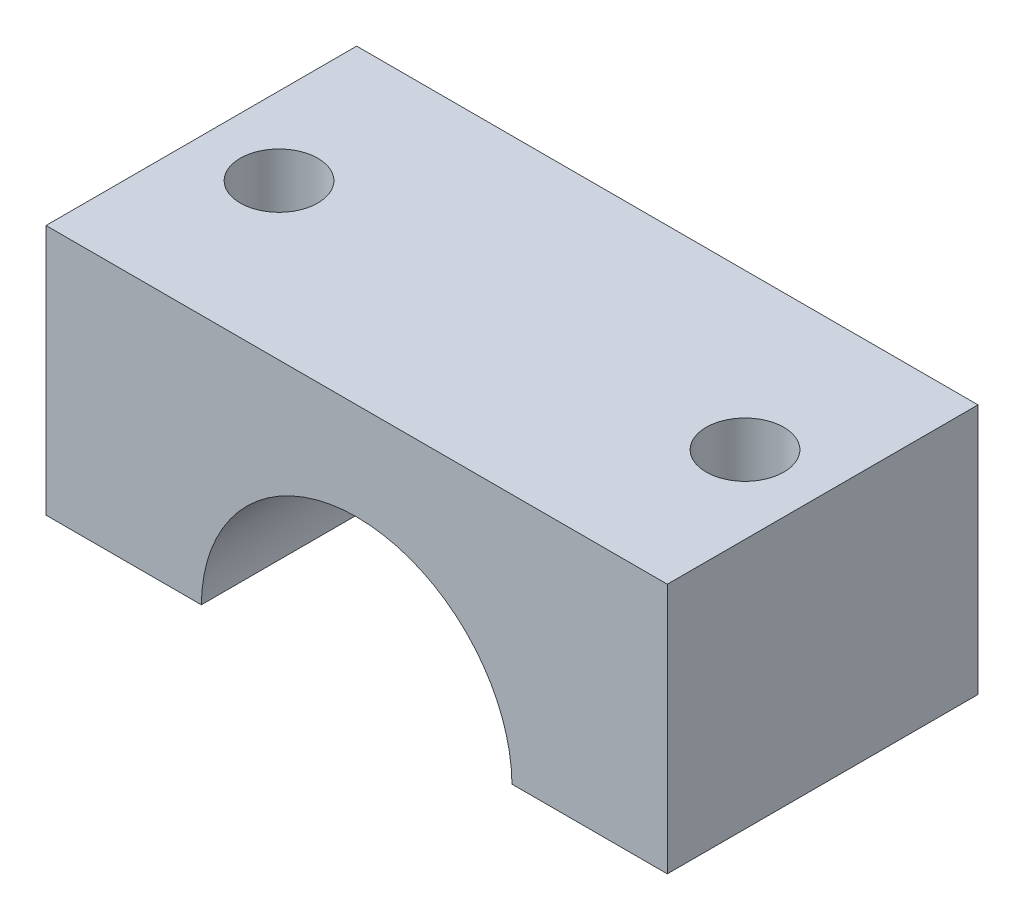
ISO-10303-21;
HEADER;
FILE_DESCRIPTION(('STEP AP214'),'2;1');
FILE_NAME('part.step','',(''),(''),'','','');
FILE_SCHEMA(('AUTOMOTIVE_DESIGN { 1 0 10303 214 1 1 1 1 }'));
ENDSEC;
DATA;
#1=APPLICATION_CONTEXT('core data for automotive mechanical design processes');
#2=APPLICATION_PROTOCOL_DEFINITION('international standard','automotive_design',2000,#1);
#3=PRODUCT_CONTEXT('',#1,'mechanical');
#4=PRODUCT('Part','Part','',(#3));
#5=PRODUCT_RELATED_PRODUCT_CATEGORY('part','',(#4));
#6=PRODUCT_DEFINITION_FORMATION('','',#4);
#7=PRODUCT_DEFINITION_CONTEXT('part definition',#1,'design');
#8=PRODUCT_DEFINITION('design','',#6,#7);
#9=PRODUCT_DEFINITION_SHAPE('','',#8);
#10=(LENGTH_UNIT() NAMED_UNIT(*) SI_UNIT(.MILLI.,.METRE.));
#11=(NAMED_UNIT(*) PLANE_ANGLE_UNIT() SI_UNIT($,.RADIAN.));
#12=(NAMED_UNIT(*) SI_UNIT($,.STERADIAN.) SOLID_ANGLE_UNIT());
#13=UNCERTAINTY_MEASURE_WITH_UNIT(LENGTH_MEASURE(1.E-05),#10,'distance_accuracy_value','');
#14=(GEOMETRIC_REPRESENTATION_CONTEXT(3) GLOBAL_UNCERTAINTY_ASSIGNED_CONTEXT((#13)) GLOBAL_UNIT_ASSIGNED_CONTEXT((#10,
#11,#12)) REPRESENTATION_CONTEXT('',''));
#15=CARTESIAN_POINT('',(0.,0.,0.));
#16=DIRECTION('',(0.,0.,1.));
#17=DIRECTION('',(1.,0.,0.));
#18=AXIS2_PLACEMENT_3D('',#15,#16,#17);
#19=CARTESIAN_POINT('',(0.,0.,0.));
#20=DIRECTION('',(0.,-1.,0.));
#21=DIRECTION('',(0.,0.,-1.));
#22=AXIS2_PLACEMENT_3D('',#19,#20,#21);
#23=PLANE('',#22);
#24=CARTESIAN_POINT('',(-19.05,0.,0.));
#25=DIRECTION('',(0.,-1.,0.));
#26=DIRECTION('',(0.,0.,-1.));
#27=AXIS2_PLACEMENT_3D('',#24,#25,#26);
#28=CIRCLE('',#27,3.175);
#29=CARTESIAN_POINT('',(-19.05,0.,-3.17499999999999));
#30=VERTEX_POINT('',#29);
#31=EDGE_CURVE('E146',#30,#30,#28,.T.);
#32=ORIENTED_EDGE('',*,*,#31,.F.);
#33=EDGE_LOOP('',(#32));
#34=FACE_BOUND('',#33,.T.);
#35=DIRECTION('',(0.,0.,-1.));
#36=VECTOR('',#35,1.);
#37=CARTESIAN_POINT('',(-12.6993649841242,0.,12.7));
#38=LINE('',#37,#36);
#39=CARTESIAN_POINT('',(-12.6993649841242,0.,12.7));
#40=VERTEX_POINT('',#39);
#41=CARTESIAN_POINT('',(-12.6993649841242,0.,-12.7));
#42=VERTEX_POINT('',#41);
#43=EDGE_CURVE('E11',#40,#42,#38,.T.);
#44=ORIENTED_EDGE('',*,*,#43,.F.);
#45=DIRECTION('',(1.,0.,0.));
#46=VECTOR('',#45,1.);
#47=CARTESIAN_POINT('',(-25.4,0.,12.7));
#48=LINE('',#47,#46);
#49=CARTESIAN_POINT('',(-25.4,0.,12.7));
#50=VERTEX_POINT('',#49);
#51=EDGE_CURVE('E119',#50,#40,#48,.T.);
#52=ORIENTED_EDGE('',*,*,#51,.F.);
#53=DIRECTION('',(0.,0.,1.));
#54=VECTOR('',#53,1.);
#55=CARTESIAN_POINT('',(-25.4,0.,12.7));
#56=LINE('',#55,#54);
#57=CARTESIAN_POINT('',(-25.4,0.,-12.7));
#58=VERTEX_POINT('',#57);
#59=EDGE_CURVE('E111',#58,#50,#56,.T.);
#60=ORIENTED_EDGE('',*,*,#59,.F.);
#61=DIRECTION('',(-1.,0.,0.));
#62=VECTOR('',#61,1.);
#63=CARTESIAN_POINT('',(-25.4,0.,-12.7));
#64=LINE('',#63,#62);
#65=EDGE_CURVE('E105',#42,#58,#64,.T.);
#66=ORIENTED_EDGE('',*,*,#65,.F.);
#67=EDGE_LOOP('',(#44,#52,#60,#66));
#68=FACE_BOUND('',#67,.T.);
#69=ADVANCED_FACE('F37',(#34,#68),#23,.T.);
#70=CARTESIAN_POINT('',(25.4,20.5105,12.7));
#71=DIRECTION('',(-1.,0.,0.));
#72=DIRECTION('',(0.,0.,1.));
#73=AXIS2_PLACEMENT_3D('',#70,#71,#72);
#74=PLANE('',#73);
#75=DIRECTION('',(0.,0.,-1.));
#76=VECTOR('',#75,1.);
#77=CARTESIAN_POINT('',(25.4,0.,12.7));
#78=LINE('',#77,#76);
#79=CARTESIAN_POINT('',(25.4,0.,12.7));
#80=VERTEX_POINT('',#79);
#81=CARTESIAN_POINT('',(25.4,0.,-12.7));
#82=VERTEX_POINT('',#81);
#83=EDGE_CURVE('E112',#80,#82,#78,.T.);
#84=ORIENTED_EDGE('',*,*,#83,.T.);
#85=DIRECTION('',(0.,-1.,0.));
#86=VECTOR('',#85,1.);
#87=CARTESIAN_POINT('',(25.4,20.5105,-12.7));
#88=LINE('',#87,#86);
#89=CARTESIAN_POINT('',(25.4,20.5105,-12.7));
#90=VERTEX_POINT('',#89);
#91=EDGE_CURVE('E129',#90,#82,#88,.T.);
#92=ORIENTED_EDGE('',*,*,#91,.F.);
#93=DIRECTION('',(0.,0.,-1.));
#94=VECTOR('',#93,1.);
#95=CARTESIAN_POINT('',(25.4,20.5105,12.7));
#96=LINE('',#95,#94);
#97=CARTESIAN_POINT('',(25.4,20.5105,12.7));
#98=VERTEX_POINT('',#97);
#99=EDGE_CURVE('E121',#98,#90,#96,.T.);
#100=ORIENTED_EDGE('',*,*,#99,.F.);
#101=DIRECTION('',(0.,-1.,0.));
#102=VECTOR('',#101,1.);
#103=CARTESIAN_POINT('',(25.4,20.5105,12.7));
#104=LINE('',#103,#102);
#105=EDGE_CURVE('E122',#98,#80,#104,.T.);
#106=ORIENTED_EDGE('',*,*,#105,.T.);
#107=EDGE_LOOP('',(#84,#92,#100,#106));
#108=FACE_BOUND('',#107,.T.);
#109=ADVANCED_FACE('F39',(#108),#74,.F.);
#110=CARTESIAN_POINT('',(-25.4,20.5105,-12.7));
#111=DIRECTION('',(0.,0.,1.));
#112=DIRECTION('',(1.,0.,0.));
#113=AXIS2_PLACEMENT_3D('',#110,#111,#112);
#114=PLANE('',#113);
#115=CARTESIAN_POINT('',(12.6993649841242,0.,-12.7));
#116=VERTEX_POINT('',#115);
#117=EDGE_CURVE('E107',#82,#116,#64,.T.);
#118=ORIENTED_EDGE('',*,*,#117,.T.);
#119=CARTESIAN_POINT('',(0.,-0.127,-12.7));
#120=DIRECTION('',(0.,0.,-1.));
#121=DIRECTION('',(-1.,0.,0.));
#122=AXIS2_PLACEMENT_3D('',#119,#120,#121);
#123=CIRCLE('',#122,12.7);
#124=EDGE_CURVE('E51',#42,#116,#123,.T.);
#125=ORIENTED_EDGE('',*,*,#124,.F.);
#126=ORIENTED_EDGE('',*,*,#65,.T.);
#127=DIRECTION('',(0.,-1.,0.));
#128=VECTOR('',#127,1.);
#129=CARTESIAN_POINT('',(-25.4,20.5105,-12.7));
#130=LINE('',#129,#128);
#131=CARTESIAN_POINT('',(-25.4,20.5105,-12.7));
#132=VERTEX_POINT('',#131);
#133=EDGE_CURVE('E127',#132,#58,#130,.T.);
#134=ORIENTED_EDGE('',*,*,#133,.F.);
#135=DIRECTION('',(-1.,0.,0.));
#136=VECTOR('',#135,1.);
#137=CARTESIAN_POINT('',(-25.4,20.5105,-12.7));
#138=LINE('',#137,#136);
#139=EDGE_CURVE('E89',#90,#132,#138,.T.);
#140=ORIENTED_EDGE('',*,*,#139,.F.);
#141=ORIENTED_EDGE('',*,*,#91,.T.);
#142=EDGE_LOOP('',(#118,#125,#126,#134,#140,#141));
#143=FACE_BOUND('',#142,.T.);
#144=ADVANCED_FACE('F104',(#143),#114,.F.);
#145=CARTESIAN_POINT('',(-25.4,20.5105,12.7));
#146=DIRECTION('',(1.,0.,0.));
#147=DIRECTION('',(0.,0.,-1.));
#148=AXIS2_PLACEMENT_3D('',#145,#146,#147);
#149=PLANE('',#148);
#150=ORIENTED_EDGE('',*,*,#59,.T.);
#151=DIRECTION('',(0.,-1.,0.));
#152=VECTOR('',#151,1.);
#153=CARTESIAN_POINT('',(-25.4,20.5105,12.7));
#154=LINE('',#153,#152);
#155=CARTESIAN_POINT('',(-25.4,20.5105,12.7));
#156=VERTEX_POINT('',#155);
#157=EDGE_CURVE('E124',#156,#50,#154,.T.);
#158=ORIENTED_EDGE('',*,*,#157,.F.);
#159=DIRECTION('',(0.,0.,1.));
#160=VECTOR('',#159,1.);
#161=CARTESIAN_POINT('',(-25.4,20.5105,12.7));
#162=LINE('',#161,#160);
#163=EDGE_CURVE('E139',#132,#156,#162,.T.);
#164=ORIENTED_EDGE('',*,*,#163,.F.);
#165=ORIENTED_EDGE('',*,*,#133,.T.);
#166=EDGE_LOOP('',(#150,#158,#164,#165));
#167=FACE_BOUND('',#166,.T.);
#168=ADVANCED_FACE('F189',(#167),#149,.F.);
#169=CARTESIAN_POINT('',(-25.4,20.5105,12.7));
#170=DIRECTION('',(0.,0.,-1.));
#171=DIRECTION('',(-1.,0.,0.));
#172=AXIS2_PLACEMENT_3D('',#169,#170,#171);
#173=PLANE('',#172);
#174=ORIENTED_EDGE('',*,*,#51,.T.);
#175=CARTESIAN_POINT('',(0.,-0.127,12.7));
#176=DIRECTION('',(0.,0.,-1.));
#177=DIRECTION('',(-1.,0.,0.));
#178=AXIS2_PLACEMENT_3D('',#175,#176,#177);
#179=CIRCLE('',#178,12.7);
#180=CARTESIAN_POINT('',(12.6993649841242,0.,12.7));
#181=VERTEX_POINT('',#180);
#182=EDGE_CURVE('E98',#40,#181,#179,.T.);
#183=ORIENTED_EDGE('',*,*,#182,.T.);
#184=EDGE_CURVE('E81',#181,#80,#48,.T.);
#185=ORIENTED_EDGE('',*,*,#184,.T.);
#186=ORIENTED_EDGE('',*,*,#105,.F.);
#187=DIRECTION('',(1.,0.,0.));
#188=VECTOR('',#187,1.);
#189=CARTESIAN_POINT('',(-25.4,20.5105,12.7));
#190=LINE('',#189,#188);
#191=EDGE_CURVE('E60',#156,#98,#190,.T.);
#192=ORIENTED_EDGE('',*,*,#191,.F.);
#193=ORIENTED_EDGE('',*,*,#157,.T.);
#194=EDGE_LOOP('',(#174,#183,#185,#186,#192,#193));
#195=FACE_BOUND('',#194,.T.);
#196=ADVANCED_FACE('F131',(#195),#173,.F.);
#197=CARTESIAN_POINT('',(0.,20.5105,0.));
#198=DIRECTION('',(0.,-1.,0.));
#199=DIRECTION('',(0.,0.,-1.));
#200=AXIS2_PLACEMENT_3D('',#197,#198,#199);
#201=PLANE('',#200);
#202=CARTESIAN_POINT('',(19.05,20.5105,0.));
#203=DIRECTION('',(0.,-1.,0.));
#204=DIRECTION('',(0.,0.,-1.));
#205=AXIS2_PLACEMENT_3D('',#202,#203,#204);
#206=CIRCLE('',#205,3.17499999999999);
#207=CARTESIAN_POINT('',(19.05,20.5105,-3.17499999999999));
#208=VERTEX_POINT('',#207);
#209=EDGE_CURVE('E149',#208,#208,#206,.T.);
#210=ORIENTED_EDGE('',*,*,#209,.T.);
#211=EDGE_LOOP('',(#210));
#212=FACE_BOUND('',#211,.T.);
#213=CARTESIAN_POINT('',(-19.05,20.5105,0.));
#214=DIRECTION('',(0.,-1.,0.));
#215=DIRECTION('',(0.,0.,-1.));
#216=AXIS2_PLACEMENT_3D('',#213,#214,#215);
#217=CIRCLE('',#216,3.17499999999999);
#218=CARTESIAN_POINT('',(-19.05,20.5105,-3.17499999999998));
#219=VERTEX_POINT('',#218);
#220=EDGE_CURVE('E108',#219,#219,#217,.T.);
#221=ORIENTED_EDGE('',*,*,#220,.T.);
#222=EDGE_LOOP('',(#221));
#223=FACE_BOUND('',#222,.T.);
#224=ORIENTED_EDGE('',*,*,#99,.T.);
#225=ORIENTED_EDGE('',*,*,#139,.T.);
#226=ORIENTED_EDGE('',*,*,#163,.T.);
#227=ORIENTED_EDGE('',*,*,#191,.T.);
#228=EDGE_LOOP('',(#224,#225,#226,#227));
#229=FACE_BOUND('',#228,.T.);
#230=ADVANCED_FACE('F159',(#212,#223,#229),#201,.F.);
#231=CARTESIAN_POINT('',(19.05,0.,0.));
#232=DIRECTION('',(0.,-1.,0.));
#233=DIRECTION('',(0.,0.,-1.));
#234=AXIS2_PLACEMENT_3D('',#231,#232,#233);
#235=CIRCLE('',#234,3.175);
#236=CARTESIAN_POINT('',(19.05,0.,-3.175));
#237=VERTEX_POINT('',#236);
#238=EDGE_CURVE('E152',#237,#237,#235,.T.);
#239=ORIENTED_EDGE('',*,*,#238,.F.);
#240=EDGE_LOOP('',(#239));
#241=FACE_BOUND('',#240,.T.);
#242=DIRECTION('',(0.,0.,-1.));
#243=VECTOR('',#242,1.);
#244=CARTESIAN_POINT('',(12.6993649841242,0.,12.7));
#245=LINE('',#244,#243);
#246=EDGE_CURVE('E45',#116,#181,#245,.F.);
#247=ORIENTED_EDGE('',*,*,#246,.F.);
#248=ORIENTED_EDGE('',*,*,#117,.F.);
#249=ORIENTED_EDGE('',*,*,#83,.F.);
#250=ORIENTED_EDGE('',*,*,#184,.F.);
#251=EDGE_LOOP('',(#247,#248,#249,#250));
#252=FACE_BOUND('',#251,.T.);
#253=ADVANCED_FACE('F134',(#241,#252),#23,.T.);
#254=CARTESIAN_POINT('',(0.,-0.127,12.7));
#255=DIRECTION('',(0.,0.,-1.));
#256=DIRECTION('',(-1.,0.,0.));
#257=AXIS2_PLACEMENT_3D('',#254,#255,#256);
#258=CYLINDRICAL_SURFACE('',#257,12.7);
#259=ORIENTED_EDGE('',*,*,#43,.T.);
#260=ORIENTED_EDGE('',*,*,#124,.T.);
#261=ORIENTED_EDGE('',*,*,#246,.T.);
#262=ORIENTED_EDGE('',*,*,#182,.F.);
#263=EDGE_LOOP('',(#259,#260,#261,#262));
#264=FACE_BOUND('',#263,.T.);
#265=ADVANCED_FACE('F97',(#264),#258,.F.);
#266=CARTESIAN_POINT('',(-19.05,0.,0.));
#267=DIRECTION('',(0.,-1.,0.));
#268=DIRECTION('',(0.,0.,-1.));
#269=AXIS2_PLACEMENT_3D('',#266,#267,#268);
#270=CYLINDRICAL_SURFACE('',#269,3.175);
#271=ORIENTED_EDGE('',*,*,#220,.F.);
#272=EDGE_LOOP('',(#271));
#273=FACE_BOUND('',#272,.T.);
#274=ORIENTED_EDGE('',*,*,#31,.T.);
#275=EDGE_LOOP('',(#274));
#276=FACE_BOUND('',#275,.T.);
#277=ADVANCED_FACE('F165',(#273,#276),#270,.F.);
#278=CARTESIAN_POINT('',(19.05,0.,0.));
#279=DIRECTION('',(0.,-1.,0.));
#280=DIRECTION('',(0.,0.,-1.));
#281=AXIS2_PLACEMENT_3D('',#278,#279,#280);
#282=CYLINDRICAL_SURFACE('',#281,3.175);
#283=ORIENTED_EDGE('',*,*,#209,.F.);
#284=EDGE_LOOP('',(#283));
#285=FACE_BOUND('',#284,.T.);
#286=ORIENTED_EDGE('',*,*,#238,.T.);
#287=EDGE_LOOP('',(#286));
#288=FACE_BOUND('',#287,.T.);
#289=ADVANCED_FACE('F156',(#285,#288),#282,.F.);
#290=CLOSED_SHELL('',(#69,#109,#144,#168,#196,#230,#253,#265,#277,#289));
#291=MANIFOLD_SOLID_BREP('B2',#290);
#292=ADVANCED_BREP_SHAPE_REPRESENTATION('',(#18,#291),#14);
#293=SHAPE_DEFINITION_REPRESENTATION(#9,#292);
ENDSEC;
END-ISO-10303-21;
